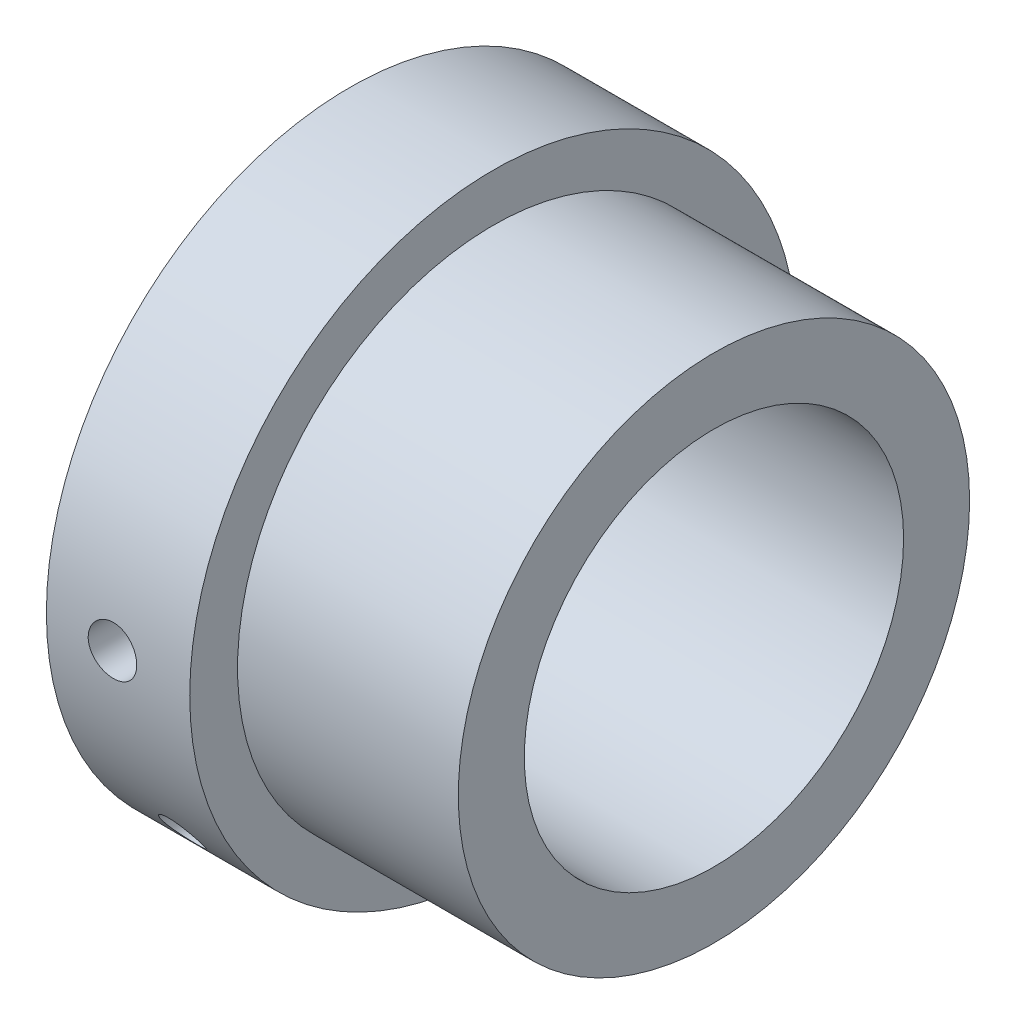
ISO-10303-21;
HEADER;
FILE_DESCRIPTION(('STEP AP214'),'2;1');
FILE_NAME('part.step','',(''),(''),'','','');
FILE_SCHEMA(('AUTOMOTIVE_DESIGN { 1 0 10303 214 1 1 1 1 }'));
ENDSEC;
DATA;
#1=APPLICATION_CONTEXT('core data for automotive mechanical design processes');
#2=APPLICATION_PROTOCOL_DEFINITION('international standard','automotive_design',2000,#1);
#3=PRODUCT_CONTEXT('',#1,'mechanical');
#4=PRODUCT('Part','Part','',(#3));
#5=PRODUCT_RELATED_PRODUCT_CATEGORY('part','',(#4));
#6=PRODUCT_DEFINITION_FORMATION('','',#4);
#7=PRODUCT_DEFINITION_CONTEXT('part definition',#1,'design');
#8=PRODUCT_DEFINITION('design','',#6,#7);
#9=PRODUCT_DEFINITION_SHAPE('','',#8);
#10=(LENGTH_UNIT() NAMED_UNIT(*) SI_UNIT(.MILLI.,.METRE.));
#11=(NAMED_UNIT(*) PLANE_ANGLE_UNIT() SI_UNIT($,.RADIAN.));
#12=(NAMED_UNIT(*) SI_UNIT($,.STERADIAN.) SOLID_ANGLE_UNIT());
#13=UNCERTAINTY_MEASURE_WITH_UNIT(LENGTH_MEASURE(1.E-05),#10,'distance_accuracy_value','');
#14=(GEOMETRIC_REPRESENTATION_CONTEXT(3) GLOBAL_UNCERTAINTY_ASSIGNED_CONTEXT((#13)) GLOBAL_UNIT_ASSIGNED_CONTEXT((#10,
#11,#12)) REPRESENTATION_CONTEXT('',''));
#15=CARTESIAN_POINT('',(0.,0.,0.));
#16=DIRECTION('',(0.,0.,1.));
#17=DIRECTION('',(1.,0.,0.));
#18=AXIS2_PLACEMENT_3D('',#15,#16,#17);
#19=CARTESIAN_POINT('',(7.62,0.,0.));
#20=DIRECTION('',(1.,0.,0.));
#21=DIRECTION('',(0.,0.,-1.));
#22=AXIS2_PLACEMENT_3D('',#19,#20,#21);
#23=PLANE('',#22);
#24=CARTESIAN_POINT('',(7.62,0.,0.));
#25=DIRECTION('',(1.,0.,0.));
#26=DIRECTION('',(0.,0.,-1.));
#27=AXIS2_PLACEMENT_3D('',#24,#25,#26);
#28=CIRCLE('',#27,5.35);
#29=CARTESIAN_POINT('',(7.62,0.,-5.35));
#30=VERTEX_POINT('',#29);
#31=EDGE_CURVE('E130',#30,#30,#28,.T.);
#32=ORIENTED_EDGE('',*,*,#31,.T.);
#33=EDGE_LOOP('',(#32));
#34=FACE_BOUND('',#33,.T.);
#35=CARTESIAN_POINT('',(7.62,0.,0.));
#36=DIRECTION('',(1.,0.,0.));
#37=DIRECTION('',(0.,0.,-1.));
#38=AXIS2_PLACEMENT_3D('',#35,#36,#37);
#39=CIRCLE('',#38,3.96875);
#40=CARTESIAN_POINT('',(7.62,0.,-3.96875));
#41=VERTEX_POINT('',#40);
#42=EDGE_CURVE('E78',#41,#41,#39,.T.);
#43=ORIENTED_EDGE('',*,*,#42,.F.);
#44=EDGE_LOOP('',(#43));
#45=FACE_BOUND('',#44,.T.);
#46=ADVANCED_FACE('F35',(#34,#45),#23,.T.);
#47=CARTESIAN_POINT('',(0.,0.,0.));
#48=DIRECTION('',(1.,0.,0.));
#49=DIRECTION('',(0.,0.,-1.));
#50=AXIS2_PLACEMENT_3D('',#47,#48,#49);
#51=PLANE('',#50);
#52=CARTESIAN_POINT('',(0.,0.,0.));
#53=DIRECTION('',(1.,0.,0.));
#54=DIRECTION('',(0.,0.,-1.));
#55=AXIS2_PLACEMENT_3D('',#52,#53,#54);
#56=CIRCLE('',#55,6.35);
#57=CARTESIAN_POINT('',(0.,0.,-6.35));
#58=VERTEX_POINT('',#57);
#59=EDGE_CURVE('E55',#58,#58,#56,.T.);
#60=ORIENTED_EDGE('',*,*,#59,.F.);
#61=EDGE_LOOP('',(#60));
#62=FACE_BOUND('',#61,.T.);
#63=CARTESIAN_POINT('',(0.,0.,0.));
#64=DIRECTION('',(1.,0.,0.));
#65=DIRECTION('',(0.,0.,-1.));
#66=AXIS2_PLACEMENT_3D('',#63,#64,#65);
#67=CIRCLE('',#66,3.96875);
#68=CARTESIAN_POINT('',(0.,0.,-3.96875));
#69=VERTEX_POINT('',#68);
#70=EDGE_CURVE('E81',#69,#69,#67,.T.);
#71=ORIENTED_EDGE('',*,*,#70,.T.);
#72=EDGE_LOOP('',(#71));
#73=FACE_BOUND('',#72,.T.);
#74=ADVANCED_FACE('F63',(#62,#73),#51,.F.);
#75=CARTESIAN_POINT('',(7.62,0.,0.));
#76=DIRECTION('',(-1.,0.,0.));
#77=DIRECTION('',(0.,0.,1.));
#78=AXIS2_PLACEMENT_3D('',#75,#76,#77);
#79=CYLINDRICAL_SURFACE('',#78,6.35);
#80=CARTESIAN_POINT('',(1.1310862135853,-3.81,-5.08));
#81=CARTESIAN_POINT('',(1.1273074103488,-3.83670016409556,-5.05998665050535));
#82=CARTESIAN_POINT('',(1.12625107344914,-3.86346071609858,-5.03957613850093));
#83=CARTESIAN_POINT('',(1.12946296625514,-3.91659363663765,-4.99838949073798));
#84=CARTESIAN_POINT('',(1.13375797171626,-3.94296337967661,-4.9776120333048));
#85=CARTESIAN_POINT('',(1.14793046063186,-3.99580241982986,-4.93530888541452));
#86=CARTESIAN_POINT('',(1.15807411132325,-4.02221185776081,-4.91379715844621));
#87=CARTESIAN_POINT('',(1.18417423920228,-4.07290881530768,-4.87185669391869));
#88=CARTESIAN_POINT('',(1.20011886789206,-4.09720053587885,-4.8514258454061));
#89=CARTESIAN_POINT('',(1.23229123404134,-4.13583091066784,-4.81848984233349));
#90=CARTESIAN_POINT('',(1.24700588442575,-4.15097244175653,-4.80544274393035));
#91=CARTESIAN_POINT('',(1.27940237293606,-4.17920917922161,-4.78090557898058));
#92=CARTESIAN_POINT('',(1.29707940847517,-4.19230763249837,-4.76941304582872));
#93=CARTESIAN_POINT('',(1.33135444126634,-4.21337244238693,-4.75080503611325));
#94=CARTESIAN_POINT('',(1.34741800259911,-4.22183987087403,-4.7432759740034));
#95=CARTESIAN_POINT('',(1.38118963097558,-4.23668157724432,-4.73002413271355));
#96=CARTESIAN_POINT('',(1.39889684292003,-4.24305693577123,-4.72430042105221));
#97=CARTESIAN_POINT('',(1.43574620928812,-4.25334714899132,-4.71503841420604));
#98=CARTESIAN_POINT('',(1.45489922111386,-4.25724076517623,-4.71151898739946));
#99=CARTESIAN_POINT('',(1.49386291191859,-4.26214762690369,-4.70708077321789));
#100=CARTESIAN_POINT('',(1.51367297633237,-4.26316349130313,-4.70615962132324));
#101=CARTESIAN_POINT('',(1.55045051857327,-4.26229353444219,-4.70694734535082));
#102=CARTESIAN_POINT('',(1.56743645902915,-4.26078531934921,-4.70831397420851));
#103=CARTESIAN_POINT('',(1.60081972974509,-4.25566854508927,-4.71293931696201));
#104=CARTESIAN_POINT('',(1.6172170113063,-4.25205981257287,-4.71619818701879));
#105=CARTESIAN_POINT('',(1.64905214289345,-4.24295638823937,-4.72438970498395));
#106=CARTESIAN_POINT('',(1.6644887575279,-4.23745932495115,-4.72932445746989));
#107=CARTESIAN_POINT('',(1.69413784299895,-4.2248522525324,-4.74059015490724));
#108=CARTESIAN_POINT('',(1.70834969405036,-4.21774143330554,-4.74692180104671));
#109=CARTESIAN_POINT('',(1.74159142584521,-4.19861954709216,-4.76385572875571));
#110=CARTESIAN_POINT('',(1.75986660724002,-4.18585189477416,-4.77508947652226));
#111=CARTESIAN_POINT('',(1.79343287325246,-4.158151326179,-4.79923087823228));
#112=CARTESIAN_POINT('',(1.80871751785829,-4.1432138551444,-4.81214204714621));
#113=CARTESIAN_POINT('',(1.84026919219236,-4.10719841513138,-4.84294631020778));
#114=CARTESIAN_POINT('',(1.85556618760021,-4.08558632886326,-4.86120791332548));
#115=CARTESIAN_POINT('',(1.88137576821344,-4.04048564603081,-4.89875900599605));
#116=CARTESIAN_POINT('',(1.89188311698793,-4.01699502851371,-4.91804959491492));
#117=CARTESIAN_POINT('',(1.90827873051137,-3.96842951747874,-4.95732356427644));
#118=CARTESIAN_POINT('',(1.91410019992331,-3.94333703530372,-4.97731286497628));
#119=CARTESIAN_POINT('',(1.9208126993765,-3.89248682991864,-5.01717883685181));
#120=CARTESIAN_POINT('',(1.92171504118839,-3.86673076990905,-5.03705566134277));
#121=CARTESIAN_POINT('',(1.91943639400927,-3.83062792487734,-5.0644804635371));
#122=CARTESIAN_POINT('',(1.9183801624172,-3.82030570113289,-5.07227162070097));
#123=CARTESIAN_POINT('',(1.9169137864147,-3.81,-5.08));
#124=B_SPLINE_CURVE_WITH_KNOTS('',3,(#80,#81,#82,#83,#84,#85,#86,#87,#88,#89,#90,#91,#92,#93,
#94,#95,#96,#97,#98,#99,#100,#101,#102,#103,#104,#105,#106,#107,#108,#109,#110,#111,#112,#113,
#114,#115,#116,#117,#118,#119,#120,#121,#122,#123),.UNSPECIFIED.,.F.,.F.,(4,2,2,2,2,2,2,2,2,2,2,
2,2,2,2,2,2,2,2,2,2,4),(0.,0.100602962659255,0.201711325757644,0.307831579932841,
0.413736289277865,0.487943450039435,0.562031450576583,0.620779037461321,0.679496230758781,
0.738709402221219,0.797868670245561,0.848942465179126,0.900020475678274,0.951162868735978,
1.00233099199705,1.07681018222779,1.15144803680098,1.24743975733277,1.34353617358291,
1.44097928368367,1.53819822384626,1.57709869586067),.UNSPECIFIED.);
#125=CARTESIAN_POINT('',(1.1310862135853,-3.81,-5.08));
#126=VERTEX_POINT('',#125);
#127=CARTESIAN_POINT('',(1.9169137864147,-3.81,-5.08));
#128=VERTEX_POINT('',#127);
#129=EDGE_CURVE('E44',#126,#128,#124,.T.);
#130=ORIENTED_EDGE('',*,*,#129,.T.);
#131=DIRECTION('',(-1.,0.,0.));
#132=VECTOR('',#131,1.);
#133=CARTESIAN_POINT('',(7.62,-3.81,-5.08));
#134=LINE('',#133,#132);
#135=EDGE_CURVE('E11',#128,#126,#134,.T.);
#136=ORIENTED_EDGE('',*,*,#135,.T.);
#137=EDGE_LOOP('',(#130,#136));
#138=FACE_BOUND('',#137,.T.);
#139=CARTESIAN_POINT('',(1.12712500000001,-3.86593319292026,5.03756494229875));
#140=CARTESIAN_POINT('',(1.1271249268216,-3.8392136354108,5.05806964823215));
#141=CARTESIAN_POINT('',(1.12982011408244,-3.81230777250014,5.07837731258606));
#142=CARTESIAN_POINT('',(1.14085812124443,-3.75890390094624,5.11803155501354));
#143=CARTESIAN_POINT('',(1.14920311851895,-3.73240605357575,5.13737775946463));
#144=CARTESIAN_POINT('',(1.16955579736268,-3.68596737245955,5.170763408327));
#145=CARTESIAN_POINT('',(1.18050416059085,-3.66577101936544,5.18509277787649));
#146=CARTESIAN_POINT('',(1.20628592368519,-3.62695926696501,5.212314830602));
#147=CARTESIAN_POINT('',(1.22111351780607,-3.608341559696,5.22520962004272));
#148=CARTESIAN_POINT('',(1.25187728490467,-3.57633294757058,5.24715703905342));
#149=CARTESIAN_POINT('',(1.26723825440713,-3.56258480602141,5.25649330540897));
#150=CARTESIAN_POINT('',(1.30050364375834,-3.53730751517441,5.2735365628973));
#151=CARTESIAN_POINT('',(1.31840755320554,-3.52577792167563,5.28124388021113));
#152=CARTESIAN_POINT('',(1.35655276409615,-3.50545983556497,5.29475231970968));
#153=CARTESIAN_POINT('',(1.37680904146925,-3.49669039044207,5.30054021021314));
#154=CARTESIAN_POINT('',(1.41897186483129,-3.48256414778071,5.30983236091619));
#155=CARTESIAN_POINT('',(1.44087711507065,-3.47720470135972,5.31333839370847));
#156=CARTESIAN_POINT('',(1.48278657794326,-3.47070568105289,5.31758544448331));
#157=CARTESIAN_POINT('',(1.50269507436219,-3.46912970061378,5.31861249707329));
#158=CARTESIAN_POINT('',(1.54252321095424,-3.46899155928612,5.31870264285304));
#159=CARTESIAN_POINT('',(1.56244284355337,-3.47042820079955,5.31776651645911));
#160=CARTESIAN_POINT('',(1.60051170899984,-3.47605560992788,5.31408952009604));
#161=CARTESIAN_POINT('',(1.61869646628778,-3.48008100724868,5.31145699721213));
#162=CARTESIAN_POINT('',(1.65404856978977,-3.49051753395339,5.30460422992244));
#163=CARTESIAN_POINT('',(1.67121584119134,-3.49692883851374,5.30038386893526));
#164=CARTESIAN_POINT('',(1.70485329196628,-3.5121579924167,5.29030552777349));
#165=CARTESIAN_POINT('',(1.72126446320468,-3.52106512293664,5.28438654486418));
#166=CARTESIAN_POINT('',(1.75230149788748,-3.54077687858786,5.27119906397824));
#167=CARTESIAN_POINT('',(1.76692668916079,-3.55158221441923,5.26393006048684));
#168=CARTESIAN_POINT('',(1.7958486324538,-3.57609054103609,5.24731552219702));
#169=CARTESIAN_POINT('',(1.80989937420669,-3.58998532285461,5.23782583304647));
#170=CARTESIAN_POINT('',(1.83545789453093,-3.61919247826826,5.21768732663845));
#171=CARTESIAN_POINT('',(1.84696430302025,-3.63450560935502,5.20703788945955));
#172=CARTESIAN_POINT('',(1.86915103871758,-3.66879229089926,5.1829500782919));
#173=CARTESIAN_POINT('',(1.87936673160392,-3.68794824661479,5.16934391743054));
#174=CARTESIAN_POINT('',(1.8964007528715,-3.7270687242649,5.14121006008596));
#175=CARTESIAN_POINT('',(1.90321714914054,-3.74703369908028,5.12668184479585));
#176=CARTESIAN_POINT('',(1.9145122765028,-3.79100294298973,5.09427817490664));
#177=CARTESIAN_POINT('',(1.91833953580406,-3.8150808894318,5.07627484819691));
#178=CARTESIAN_POINT('',(1.92159766717226,-3.86317085018693,5.03977429300028));
#179=CARTESIAN_POINT('',(1.92102464959599,-3.88718278739408,5.0212766419472));
#180=CARTESIAN_POINT('',(1.91522662596335,-3.93801379401877,4.9815387736605));
#181=CARTESIAN_POINT('',(1.90935303555366,-3.96474769581075,4.96028185070325));
#182=CARTESIAN_POINT('',(1.89210796513954,-4.01678963995018,4.91823330888879));
#183=CARTESIAN_POINT('',(1.88073701617414,-4.04209781975727,4.89744164529094));
#184=CARTESIAN_POINT('',(1.85502683152216,-4.08605915590504,4.86079059135888));
#185=CARTESIAN_POINT('',(1.84161272385443,-4.10508222214455,4.84472531173107));
#186=CARTESIAN_POINT('',(1.81098002648749,-4.14108628577517,4.81398603854567));
#187=CARTESIAN_POINT('',(1.79376713790178,-4.15807028498665,4.79931000671074));
#188=CARTESIAN_POINT('',(1.76004973616495,-4.185533479858,4.77535965743385));
#189=CARTESIAN_POINT('',(1.7443478242895,-4.19659957815033,4.76563023718205));
#190=CARTESIAN_POINT('',(1.71078118972755,-4.21665145058262,4.74789734875776));
#191=CARTESIAN_POINT('',(1.69291928089848,-4.22563988778558,4.73989167207183));
#192=CARTESIAN_POINT('',(1.65847668752781,-4.23971250621507,4.72730493574317));
#193=CARTESIAN_POINT('',(1.64219000704911,-4.24519985652576,4.722373709052));
#194=CARTESIAN_POINT('',(1.60861077660303,-4.2540718365167,4.71438318557331));
#195=CARTESIAN_POINT('',(1.59131889339518,-4.2574578430171,4.71132266310274));
#196=CARTESIAN_POINT('',(1.55611475393944,-4.26190585483227,4.70729943292096));
#197=CARTESIAN_POINT('',(1.53820012402701,-4.26295767541261,4.70634591877879));
#198=CARTESIAN_POINT('',(1.50241224567989,-4.26262433042342,4.70664783854596));
#199=CARTESIAN_POINT('',(1.48453899596874,-4.26123924105635,4.70790320338341));
#200=CARTESIAN_POINT('',(1.45065353756087,-4.25632111434795,4.71234975180969));
#201=CARTESIAN_POINT('',(1.43459878760877,-4.25294577439336,4.71539877719463));
#202=CARTESIAN_POINT('',(1.40339129913322,-4.24438445704686,4.72310634480055));
#203=CARTESIAN_POINT('',(1.38823872534889,-4.23919815014856,4.72776517992565));
#204=CARTESIAN_POINT('',(1.35783742147062,-4.22675465158305,4.7388943970665));
#205=CARTESIAN_POINT('',(1.34269028856712,-4.21935876537656,4.74548522085111));
#206=CARTESIAN_POINT('',(1.31390447787453,-4.20304437286163,4.75994088099019));
#207=CARTESIAN_POINT('',(1.3002669373991,-4.1941247312636,4.76780666704315));
#208=CARTESIAN_POINT('',(1.26780550054195,-4.17002264653716,4.78892296849341));
#209=CARTESIAN_POINT('',(1.25002060381243,-4.15401172488706,4.80283151830985));
#210=CARTESIAN_POINT('',(1.21809588693695,-4.11986405645101,4.83215574496593));
#211=CARTESIAN_POINT('',(1.20396361034512,-4.10172302100088,4.84757445156357));
#212=CARTESIAN_POINT('',(1.17905237975784,-4.06354328770071,4.87962588155803));
#213=CARTESIAN_POINT('',(1.16834063150195,-4.04347558682821,4.89627584228386));
#214=CARTESIAN_POINT('',(1.15058331650321,-4.00221746147103,4.93005731786736));
#215=CARTESIAN_POINT('',(1.14353275761778,-3.98102860940829,4.94718814325601));
#216=CARTESIAN_POINT('',(1.13459607077777,-3.94417483152547,4.97658200500612));
#217=CARTESIAN_POINT('',(1.13180424853245,-3.92869605216406,4.98881142531121));
#218=CARTESIAN_POINT('',(1.12806811377937,-3.89747775332312,5.01323854292444));
#219=CARTESIAN_POINT('',(1.12712504328574,-3.88173806571641,5.02543621341223));
#220=CARTESIAN_POINT('',(1.12712500000001,-3.86593319292026,5.03756494229875));
#221=B_SPLINE_CURVE_WITH_KNOTS('',3,(#139,#140,#141,#142,#143,#144,#145,#146,#147,#148,#149,
#150,#151,#152,#153,#154,#155,#156,#157,#158,#159,#160,#161,#162,#163,#164,#165,#166,#167,#168,
#169,#170,#171,#172,#173,#174,#175,#176,#177,#178,#179,#180,#181,#182,#183,#184,#185,#186,#187,
#188,#189,#190,#191,#192,#193,#194,#195,#196,#197,#198,#199,#200,#201,#202,#203,#204,#205,#206,
#207,#208,#209,#210,#211,#212,#213,#214,#215,#216,#217,#218,#219,#220),.UNSPECIFIED.,.T.,.F.,(4,
2,2,2,2,2,2,2,2,2,2,2,2,2,2,2,2,2,2,2,2,2,2,2,2,2,2,2,2,2,2,2,2,2,2,2,2,2,2,2,4),(0.,
0.100974233923036,0.201987404350408,0.282899330938074,0.363690848816604,0.431305862790234,
0.498907324667257,0.566965557092956,0.634970857219137,0.694647909191447,0.754301242432324,
0.810478383936165,0.86665965085379,0.925185982392271,0.983734273444255,1.04924702344026,
1.11479496553844,1.19137026078297,1.26798903087833,1.35855608052796,1.44920319651064,
1.5527132441846,1.6562132948946,1.74075643969528,1.82517355683309,1.88954244580907,
1.95382836605598,2.00724487171332,2.06062634132216,2.11424027566758,2.16785253352883,
2.2176992503064,2.26755504145009,2.32165446396735,2.37579437102608,2.45837544156852,
2.54112572348019,2.62541398166469,2.70958700645831,2.76927414287194,2.82900136411342),.UNSPECIFIED.);
#222=CARTESIAN_POINT('',(1.12712500000001,-3.86593319292026,5.03756494229875));
#223=VERTEX_POINT('',#222);
#224=EDGE_CURVE('E58',#223,#223,#221,.T.);
#225=ORIENTED_EDGE('',*,*,#224,.T.);
#226=EDGE_LOOP('',(#225));
#227=FACE_BOUND('',#226,.T.);
#228=CARTESIAN_POINT('',(1.89094283641369,0.,6.35));
#229=CARTESIAN_POINT('',(1.89094159048129,-0.0284857193049498,6.34999973306454));
#230=CARTESIAN_POINT('',(1.88853880546916,-0.0569909297890136,6.34980627761363));
#231=CARTESIAN_POINT('',(1.8789888398343,-0.113212953756505,6.34905314531252));
#232=CARTESIAN_POINT('',(1.87183625779753,-0.14092883215566,6.34849305153583));
#233=CARTESIAN_POINT('',(1.85299460623761,-0.194749765443451,6.34706994815829));
#234=CARTESIAN_POINT('',(1.84130807252117,-0.220855711313532,6.34620710790711));
#235=CARTESIAN_POINT('',(1.81373471850442,-0.270729092285767,6.34427532502263));
#236=CARTESIAN_POINT('',(1.79784880799933,-0.294497032388439,6.3432064270453));
#237=CARTESIAN_POINT('',(1.76228707024275,-0.339082176985212,6.34097968761358));
#238=CARTESIAN_POINT('',(1.74260338468129,-0.359893105071176,6.33982166478266));
#239=CARTESIAN_POINT('',(1.70002140030455,-0.397919651537022,6.33754871818422));
#240=CARTESIAN_POINT('',(1.6771229616143,-0.415135113395858,6.33643379629473));
#241=CARTESIAN_POINT('',(1.62872378863297,-0.44550304300868,6.3343713070339));
#242=CARTESIAN_POINT('',(1.60321960756653,-0.458650034119346,6.33342396597426));
#243=CARTESIAN_POINT('',(1.55035696404539,-0.480472836968702,6.33180592668721));
#244=CARTESIAN_POINT('',(1.5229985320434,-0.489148722117044,6.3311352239178));
#245=CARTESIAN_POINT('',(1.46726657987622,-0.501764932611031,6.33014789143902));
#246=CARTESIAN_POINT('',(1.43889537714847,-0.505715434693829,6.3298305009277));
#247=CARTESIAN_POINT('',(1.38189093364751,-0.508800173836419,6.32958331178566));
#248=CARTESIAN_POINT('',(1.35325769745069,-0.507934494850928,6.32965350639863));
#249=CARTESIAN_POINT('',(1.29661164840987,-0.501419861212218,6.33017286623199));
#250=CARTESIAN_POINT('',(1.26859755544971,-0.495781957877885,6.33062115586704));
#251=CARTESIAN_POINT('',(1.21391457917599,-0.479900079390112,6.33184481894731));
#252=CARTESIAN_POINT('',(1.18724570809859,-0.4696560623478,6.33262019536711));
#253=CARTESIAN_POINT('',(1.13597493592849,-0.444840341898172,6.33441167184783));
#254=CARTESIAN_POINT('',(1.11137544948752,-0.430263670413183,6.33542804798118));
#255=CARTESIAN_POINT('',(1.0649681398234,-0.397200003571505,6.33758674207351));
#256=CARTESIAN_POINT('',(1.0431603686517,-0.378712935322625,6.33872906237996));
#257=CARTESIAN_POINT('',(1.00289126732389,-0.338291224851532,6.34101482430859));
#258=CARTESIAN_POINT('',(0.984439527490998,-0.316347026823728,6.34215826003943));
#259=CARTESIAN_POINT('',(0.951480384667291,-0.269667338287703,6.34431434523044));
#260=CARTESIAN_POINT('',(0.936972984048608,-0.244931846100804,6.34532699461195));
#261=CARTESIAN_POINT('',(0.912314966694846,-0.193365559634019,6.34710757815558));
#262=CARTESIAN_POINT('',(0.902164763696921,-0.166534566661897,6.3478754890768));
#263=CARTESIAN_POINT('',(0.886515927733026,-0.111541725627414,6.34907979854185));
#264=CARTESIAN_POINT('',(0.881017205802822,-0.0833799030293798,6.34951620342605));
#265=CARTESIAN_POINT('',(0.874839419311573,-0.0266079550879084,6.3500075151304));
#266=CARTESIAN_POINT('',(0.874147105738673,0.00200071984579208,6.35006347066203));
#267=CARTESIAN_POINT('',(0.877567096564487,0.058927339165514,6.34979037777372));
#268=CARTESIAN_POINT('',(0.881679359709895,0.0872452860456938,6.3494613326595));
#269=CARTESIAN_POINT('',(0.894580792673074,0.142748910861868,6.34845592449252));
#270=CARTESIAN_POINT('',(0.903363832546797,0.169936022602307,6.34778001670416));
#271=CARTESIAN_POINT('',(0.9253512462288,0.222450620449516,6.34615683214426));
#272=CARTESIAN_POINT('',(0.938555684618679,0.247778079386495,6.3452095514089));
#273=CARTESIAN_POINT('',(0.969044442229297,0.295914780029602,6.34314724059117));
#274=CARTESIAN_POINT('',(0.986337551516296,0.318718438656433,6.34203185099799));
#275=CARTESIAN_POINT('',(1.02450004822636,0.361103896466337,6.33975988334265));
#276=CARTESIAN_POINT('',(1.04536949291857,0.380685644045942,6.33860330462116));
#277=CARTESIAN_POINT('',(1.09014968742161,0.416116771417106,6.33637621870337));
#278=CARTESIAN_POINT('',(1.11406728236024,0.431957514397432,6.33530591436532));
#279=CARTESIAN_POINT('',(1.16423071437406,0.459397778469857,6.33337538018158));
#280=CARTESIAN_POINT('',(1.19047652976876,0.470997339050883,6.33251514837997));
#281=CARTESIAN_POINT('',(1.24452062617096,0.489611213131012,6.33110326059578));
#282=CARTESIAN_POINT('',(1.2723170673333,0.496630840273304,6.33055124712568));
#283=CARTESIAN_POINT('',(1.32869863418875,0.505902896098149,6.32981707724986));
#284=CARTESIAN_POINT('',(1.35728374604685,0.508155408352447,6.32963491436035));
#285=CARTESIAN_POINT('',(1.41434539170527,0.50782836068627,6.32966115537756));
#286=CARTESIAN_POINT('',(1.44282200477946,0.505262372155452,6.32986846233658));
#287=CARTESIAN_POINT('',(1.49893849008682,0.495399432338358,6.33064795502181));
#288=CARTESIAN_POINT('',(1.52657836099383,0.488102473554294,6.3312201413263));
#289=CARTESIAN_POINT('',(1.58023784207299,0.468988103951374,6.33266463493847));
#290=CARTESIAN_POINT('',(1.60625752903804,0.45717090757104,6.333536928009));
#291=CARTESIAN_POINT('',(1.65594582132287,0.42935307008977,6.335483367119));
#292=CARTESIAN_POINT('',(1.67961446780627,0.413352502251983,6.33655750962339));
#293=CARTESIAN_POINT('',(1.72399820699637,0.377571183669623,6.33879020633748));
#294=CARTESIAN_POINT('',(1.7447052074538,0.357780408889134,6.3399489792274));
#295=CARTESIAN_POINT('',(1.78251155330733,0.314998139026026,6.34221838384599));
#296=CARTESIAN_POINT('',(1.79961002287516,0.292005869149354,6.3433290038356));
#297=CARTESIAN_POINT('',(1.82973497156367,0.243432272528466,6.34537881046931));
#298=CARTESIAN_POINT('',(1.84275428308252,0.217846491872762,6.34631769415973));
#299=CARTESIAN_POINT('',(1.86429557931457,0.164862237306823,6.34791461959161));
#300=CARTESIAN_POINT('',(1.87282275115305,0.137465895413467,6.34857298508189));
#301=CARTESIAN_POINT('',(1.88295799863565,0.0915890290271699,6.34936504954435));
#302=CARTESIAN_POINT('',(1.88594835240292,0.0734038311266429,6.34960207664132));
#303=CARTESIAN_POINT('',(1.88994117154486,0.036815136034101,6.34991963794666));
#304=CARTESIAN_POINT('',(1.8909436417175,0.0184116393690799,6.35000017253275));
#305=CARTESIAN_POINT('',(1.89094283641369,0.,6.35));
#306=B_SPLINE_CURVE_WITH_KNOTS('',3,(#228,#229,#230,#231,#232,#233,#234,#235,#236,#237,#238,
#239,#240,#241,#242,#243,#244,#245,#246,#247,#248,#249,#250,#251,#252,#253,#254,#255,#256,#257,
#258,#259,#260,#261,#262,#263,#264,#265,#266,#267,#268,#269,#270,#271,#272,#273,#274,#275,#276,
#277,#278,#279,#280,#281,#282,#283,#284,#285,#286,#287,#288,#289,#290,#291,#292,#293,#294,#295,
#296,#297,#298,#299,#300,#301,#302,#303,#304,#305),.UNSPECIFIED.,.T.,.F.,(4,2,2,2,2,2,2,2,2,2,2,
2,2,2,2,2,2,2,2,2,2,2,2,2,2,2,2,2,2,2,2,2,2,2,2,2,2,2,4),(0.,0.0853899369780829,
0.170877145070279,0.256316609546171,0.341737578706345,0.427337233123012,0.512940613163868,
0.598658729214787,0.684375437842656,0.769907209908598,0.85543749100627,0.940770244808274,
1.02610377465822,1.11153553295622,1.19696888389491,1.2826426627841,1.36831649319753,
1.45399845696028,1.5396787819326,1.6251228323551,1.71056614913882,1.7958976055482,
1.88123030841439,1.96674815997967,2.05226738110112,2.13798215036407,2.22369612153107,
2.30931046959025,2.39492331674168,2.48029539544671,2.56566760945238,2.65103577393167,
2.73640244346323,2.82199808210229,2.90761447186854,2.99338046765522,3.0790472101739,
3.13423881348784,3.1894302835911),.UNSPECIFIED.);
#307=CARTESIAN_POINT('',(1.89094283641369,0.,6.35));
#308=VERTEX_POINT('',#307);
#309=EDGE_CURVE('E70',#308,#308,#306,.T.);
#310=ORIENTED_EDGE('',*,*,#309,.T.);
#311=EDGE_LOOP('',(#310));
#312=FACE_BOUND('',#311,.T.);
#313=CARTESIAN_POINT('',(3.,0.,0.));
#314=DIRECTION('',(1.,0.,0.));
#315=DIRECTION('',(0.,0.,-1.));
#316=AXIS2_PLACEMENT_3D('',#313,#314,#315);
#317=CIRCLE('',#316,6.35);
#318=CARTESIAN_POINT('',(3.,0.,-6.35));
#319=VERTEX_POINT('',#318);
#320=EDGE_CURVE('E74',#319,#319,#317,.T.);
#321=ORIENTED_EDGE('',*,*,#320,.F.);
#322=EDGE_LOOP('',(#321));
#323=FACE_BOUND('',#322,.T.);
#324=ORIENTED_EDGE('',*,*,#59,.T.);
#325=EDGE_LOOP('',(#324));
#326=FACE_BOUND('',#325,.T.);
#327=ADVANCED_FACE('F37',(#138,#227,#312,#323,#326),#79,.T.);
#328=CARTESIAN_POINT('',(7.62,0.,0.));
#329=DIRECTION('',(-1.,0.,0.));
#330=DIRECTION('',(0.,0.,1.));
#331=AXIS2_PLACEMENT_3D('',#328,#329,#330);
#332=CYLINDRICAL_SURFACE('',#331,3.96875);
#333=CARTESIAN_POINT('',(1.12712500000001,-3.86593319292026,0.897517192246117));
#334=CARTESIAN_POINT('',(1.12712784444321,-3.85059546150369,0.963582128239832));
#335=CARTESIAN_POINT('',(1.12800028788654,-3.83356290294999,1.0292544419874));
#336=CARTESIAN_POINT('',(1.13285047189897,-3.7961509404297,1.15966605353678));
#337=CARTESIAN_POINT('',(1.13683370893339,-3.77576566291764,1.22440349309504));
#338=CARTESIAN_POINT('',(1.14966485246856,-3.73214859680331,1.35147133313962));
#339=CARTESIAN_POINT('',(1.15844244483688,-3.7089616370032,1.413822908842));
#340=CARTESIAN_POINT('',(1.17728173300381,-3.67233466118173,1.50532901650065));
#341=CARTESIAN_POINT('',(1.18449055586871,-3.65983988103611,1.53544649106328));
#342=CARTESIAN_POINT('',(1.20131617952824,-3.63437465670541,1.59478361820304));
#343=CARTESIAN_POINT('',(1.21093051697838,-3.62140471063659,1.6240041551232));
#344=CARTESIAN_POINT('',(1.22967915480406,-3.59943604365332,1.67197297475639));
#345=CARTESIAN_POINT('',(1.23797812319732,-3.59049804176497,1.69107375255043));
#346=CARTESIAN_POINT('',(1.25632434729249,-3.57263456611313,1.72849310445338));
#347=CARTESIAN_POINT('',(1.26637489062306,-3.56370914830672,1.74681012549163));
#348=CARTESIAN_POINT('',(1.28866129512802,-3.54604329527777,1.78240033295403));
#349=CARTESIAN_POINT('',(1.30091255632722,-3.53730468340383,1.79966493433443));
#350=CARTESIAN_POINT('',(1.32800381636336,-3.52046380376115,1.83238823772964));
#351=CARTESIAN_POINT('',(1.34283750162275,-3.51236005235817,1.84785119400567));
#352=CARTESIAN_POINT('',(1.36919100861436,-3.50033201656008,1.87049419621994));
#353=CARTESIAN_POINT('',(1.37976144105394,-3.49600659681097,1.87855922791945));
#354=CARTESIAN_POINT('',(1.40210202591988,-3.4880560657612,1.89328050570147));
#355=CARTESIAN_POINT('',(1.41387199395219,-3.4844308470721,1.89993696782848));
#356=CARTESIAN_POINT('',(1.43870981780769,-3.4781171314191,1.91147115981328));
#357=CARTESIAN_POINT('',(1.45179264929328,-3.47544152051998,1.91632445942978));
#358=CARTESIAN_POINT('',(1.4788035786515,-3.47140548816101,1.92362643831279));
#359=CARTESIAN_POINT('',(1.49272986818178,-3.47004235197974,1.92608008119333));
#360=CARTESIAN_POINT('',(1.51879767372098,-3.46890984426621,1.92811876911067));
#361=CARTESIAN_POINT('',(1.53090229660087,-3.46893651685396,1.92807090866671));
#362=CARTESIAN_POINT('',(1.55489146919412,-3.47008013935606,1.92601187482253));
#363=CARTESIAN_POINT('',(1.56677596140866,-3.47119737014684,1.92400019563507));
#364=CARTESIAN_POINT('',(1.58895361952228,-3.47426305424791,1.91845811866214));
#365=CARTESIAN_POINT('',(1.59929564309147,-3.47613153754585,1.91507361326632));
#366=CARTESIAN_POINT('',(1.61932139354978,-3.48053881544153,1.90705195373507));
#367=CARTESIAN_POINT('',(1.62900499163557,-3.48307774072162,1.90241455538206));
#368=CARTESIAN_POINT('',(1.6533446981114,-3.49039897978309,1.88896258785352));
#369=CARTESIAN_POINT('',(1.66741984387725,-3.49560365892549,1.87932789140944));
#370=CARTESIAN_POINT('',(1.69370155494792,-3.50688350002756,1.85819533235401));
#371=CARTESIAN_POINT('',(1.7059022715245,-3.51296127653455,1.84669185952065));
#372=CARTESIAN_POINT('',(1.73654358391967,-3.53003968341285,1.81392694412064));
#373=CARTESIAN_POINT('',(1.75340629374397,-3.54151894926235,1.79145260793966));
#374=CARTESIAN_POINT('',(1.78337189472292,-3.56493961696653,1.7443857555692));
#375=CARTESIAN_POINT('',(1.79646592024986,-3.57688203473712,1.71978841884299));
#376=CARTESIAN_POINT('',(1.81999502514923,-3.60100662774406,1.6686951626898));
#377=CARTESIAN_POINT('',(1.83036397288563,-3.61318818121239,1.6421690566794));
#378=CARTESIAN_POINT('',(1.84872057540687,-3.63725182796304,1.5881600176791));
#379=CARTESIAN_POINT('',(1.85670570231418,-3.64913359120542,1.5606761032344));
#380=CARTESIAN_POINT('',(1.87078893722647,-3.67245715896561,1.50497474822478));
#381=CARTESIAN_POINT('',(1.87688253919225,-3.68389785689051,1.47675572704056));
#382=CARTESIAN_POINT('',(1.88752570905102,-3.70621088855625,1.41982829212603));
#383=CARTESIAN_POINT('',(1.89207594902936,-3.71708346794532,1.39112009715018));
#384=CARTESIAN_POINT('',(1.90174310101379,-3.74308341252058,1.31997140342775));
#385=CARTESIAN_POINT('',(1.90615271763532,-3.75785918148512,1.27730670802096));
#386=CARTESIAN_POINT('',(1.91300756083082,-3.78598889090967,1.19134930554957));
#387=CARTESIAN_POINT('',(1.91545191962401,-3.79934220101247,1.14805632964118));
#388=CARTESIAN_POINT('',(1.92066315030733,-3.83722127559209,1.01732217253819));
#389=CARTESIAN_POINT('',(1.92129512764771,-3.85952175130294,0.929147203931789));
#390=CARTESIAN_POINT('',(1.92003853975071,-3.89804944347551,0.751327581104407));
#391=CARTESIAN_POINT('',(1.91814403048683,-3.91426222236336,0.661679952854411));
#392=CARTESIAN_POINT('',(1.91403813459584,-3.94047561427179,0.481560957330629));
#393=CARTESIAN_POINT('',(1.91182701345962,-3.95048139497965,0.39109033909824));
#394=CARTESIAN_POINT('',(1.90849059928467,-3.96459211550521,0.205179396943166));
#395=CARTESIAN_POINT('',(1.90742415585712,-3.96838211979256,0.109713785474248));
#396=CARTESIAN_POINT('',(1.90724058771845,-3.96906693427199,-0.0812749995283741));
#397=CARTESIAN_POINT('',(1.90812407604245,-3.96595957601434,-0.176798181722986));
#398=CARTESIAN_POINT('',(1.91129270234294,-3.95286995506432,-0.367302091017419));
#399=CARTESIAN_POINT('',(1.91357728878169,-3.94289039740121,-0.462283016732913));
#400=CARTESIAN_POINT('',(1.9179246590631,-3.91611277324392,-0.651258817929799));
#401=CARTESIAN_POINT('',(1.91998753082375,-3.89931742217304,-0.745254070823959));
#402=CARTESIAN_POINT('',(1.92103751260028,-3.86758596292786,-0.892051442156716));
#403=CARTESIAN_POINT('',(1.92096064988787,-3.85490685199015,-0.945340574557471));
#404=CARTESIAN_POINT('',(1.91923826566378,-3.82736174856561,-1.05132048817455));
#405=CARTESIAN_POINT('',(1.91759310693152,-3.81249626250527,-1.10401140491827));
#406=CARTESIAN_POINT('',(1.9119406681633,-3.78064729958821,-1.20857958870066));
#407=CARTESIAN_POINT('',(1.90793572970191,-3.76366593543939,-1.26045761004859));
#408=CARTESIAN_POINT('',(1.89650854890486,-3.72771944169028,-1.36309939932683));
#409=CARTESIAN_POINT('',(1.88908953747165,-3.70875620072051,-1.41386417329703));
#410=CARTESIAN_POINT('',(1.86927595039125,-3.66896328971561,-1.51413194760297));
#411=CARTESIAN_POINT('',(1.85685200515842,-3.64812317649818,-1.56362563263528));
#412=CARTESIAN_POINT('',(1.83266856392041,-3.61611528679391,-1.63565958839196));
#413=CARTESIAN_POINT('',(1.82368736958969,-3.60532568312799,-1.65929443908184));
#414=CARTESIAN_POINT('',(1.80341161318485,-3.58369318304283,-1.70551075610423));
#415=CARTESIAN_POINT('',(1.79212004266906,-3.57285037306134,-1.72809353873009));
#416=CARTESIAN_POINT('',(1.76653660276607,-3.55134103021817,-1.77187833724596));
#417=CARTESIAN_POINT('',(1.75222328093728,-3.54067637996235,-1.79306897833154));
#418=CARTESIAN_POINT('',(1.71988246232459,-3.52024038363727,-1.83285997773098));
#419=CARTESIAN_POINT('',(1.70187661139583,-3.51046429023479,-1.85147441824098));
#420=CARTESIAN_POINT('',(1.6717928689707,-3.49744840502847,-1.87587737029036));
#421=CARTESIAN_POINT('',(1.66141932608201,-3.49343015316279,-1.88334343215298));
#422=CARTESIAN_POINT('',(1.63956850546898,-3.48608244642992,-1.89690922109188));
#423=CARTESIAN_POINT('',(1.62809114882256,-3.48275304086857,-1.90300885036501));
#424=CARTESIAN_POINT('',(1.60397984211489,-3.47700134259534,-1.9134980850696));
#425=CARTESIAN_POINT('',(1.59133400042038,-3.47459004201191,-1.91786699280221));
#426=CARTESIAN_POINT('',(1.56531394813061,-3.47099732882346,-1.92436183060462));
#427=CARTESIAN_POINT('',(1.55194105055252,-3.46981377186237,-1.9264916714782));
#428=CARTESIAN_POINT('',(1.52660782839673,-3.46888908906573,-1.92815603184175));
#429=CARTESIAN_POINT('',(1.51467130121854,-3.46899144161321,-1.9279721713973));
#430=CARTESIAN_POINT('',(1.49103731173645,-3.47025239778646,-1.92570155552463));
#431=CARTESIAN_POINT('',(1.47933992370782,-3.47141132463147,-1.92361421779897));
#432=CARTESIAN_POINT('',(1.45735460404823,-3.47454744440141,-1.91794316725115));
#433=CARTESIAN_POINT('',(1.44702581757798,-3.47645976181642,-1.91447792750805));
#434=CARTESIAN_POINT('',(1.42703539391345,-3.48094916205028,-1.90630305498204));
#435=CARTESIAN_POINT('',(1.41737390614396,-3.48352639315198,-1.9015931446186));
#436=CARTESIAN_POINT('',(1.39298005061775,-3.49097586889556,-1.88789722364275));
#437=CARTESIAN_POINT('',(1.37884729326637,-3.49627644096513,-1.87807728559927));
#438=CARTESIAN_POINT('',(1.35248000284527,-3.50774554832076,-1.85656891367283));
#439=CARTESIAN_POINT('',(1.3402514848326,-3.51391672114475,-1.84487478660499));
#440=CARTESIAN_POINT('',(1.30948364709594,-3.53128329317564,-1.81151055685868));
#441=CARTESIAN_POINT('',(1.29256091054453,-3.54295763964351,-1.78861241326721));
#442=CARTESIAN_POINT('',(1.26253372537231,-3.56674850965125,-1.7406913081638));
#443=CARTESIAN_POINT('',(1.24943813299496,-3.57886598691135,-1.71566358865353));
#444=CARTESIAN_POINT('',(1.22589670908864,-3.60336976776125,-1.66359614688387));
#445=CARTESIAN_POINT('',(1.21552976546921,-3.61575474434934,-1.63652079102712));
#446=CARTESIAN_POINT('',(1.19721801341915,-3.64019812119434,-1.58140622315447));
#447=CARTESIAN_POINT('',(1.18927579180692,-3.65225616025192,-1.55336601701496));
#448=CARTESIAN_POINT('',(1.17530443161893,-3.67590678066041,-1.49654122233923));
#449=CARTESIAN_POINT('',(1.16928024693165,-3.68749809024333,-1.4677549106121));
#450=CARTESIAN_POINT('',(1.15879419711181,-3.71008360135106,-1.40969037397509));
#451=CARTESIAN_POINT('',(1.15433164788252,-3.72107806254602,-1.38041237036334));
#452=CARTESIAN_POINT('',(1.14490103834455,-3.74732239291759,-1.30791563556657));
#453=CARTESIAN_POINT('',(1.14064281337521,-3.76220642132064,-1.26447252254842));
#454=CARTESIAN_POINT('',(1.13409149215621,-3.79049739304778,-1.1769556138386));
#455=CARTESIAN_POINT('',(1.13179925662614,-3.80390368717662,-1.13288155049016));
#456=CARTESIAN_POINT('',(1.12702729687435,-3.84186070037813,-0.999798111290183));
#457=CARTESIAN_POINT('',(1.12666483569237,-3.86410490784003,-0.910050667506339));
#458=CARTESIAN_POINT('',(1.12833623840221,-3.90228332302929,-0.729193099829014));
#459=CARTESIAN_POINT('',(1.13037262698188,-3.91821085912804,-0.638081640078255));
#460=CARTESIAN_POINT('',(1.13459575652847,-3.94365763763317,-0.455046898391275));
#461=CARTESIAN_POINT('',(1.13678236669781,-3.95318237891186,-0.363124381935274));
#462=CARTESIAN_POINT('',(1.13992541651488,-3.96616133130673,-0.1734667315614));
#463=CARTESIAN_POINT('',(1.14080318943594,-3.96923159865369,-0.0757035660096595));
#464=CARTESIAN_POINT('',(1.14051285412143,-3.96814579222808,0.119821660688317));
#465=CARTESIAN_POINT('',(1.13934385117426,-3.96398655821355,0.217583702661303));
#466=CARTESIAN_POINT('',(1.13571051409618,-3.94841816637192,0.413096974789223));
#467=CARTESIAN_POINT('',(1.13323831099222,-3.93696487723108,0.510844490970863));
#468=CARTESIAN_POINT('',(1.12894373467949,-3.90683543262054,0.705174817535278));
#469=CARTESIAN_POINT('',(1.12712087708191,-3.88816468289302,0.801758443953773));
#470=CARTESIAN_POINT('',(1.12712500000001,-3.86593319292026,0.897517192246117));
#471=B_SPLINE_CURVE_WITH_KNOTS('',3,(#333,#334,#335,#336,#337,#338,#339,#340,#341,#342,#343,
#344,#345,#346,#347,#348,#349,#350,#351,#352,#353,#354,#355,#356,#357,#358,#359,#360,#361,#362,
#363,#364,#365,#366,#367,#368,#369,#370,#371,#372,#373,#374,#375,#376,#377,#378,#379,#380,#381,
#382,#383,#384,#385,#386,#387,#388,#389,#390,#391,#392,#393,#394,#395,#396,#397,#398,#399,#400,
#401,#402,#403,#404,#405,#406,#407,#408,#409,#410,#411,#412,#413,#414,#415,#416,#417,#418,#419,
#420,#421,#422,#423,#424,#425,#426,#427,#428,#429,#430,#431,#432,#433,#434,#435,#436,#437,#438,
#439,#440,#441,#442,#443,#444,#445,#446,#447,#448,#449,#450,#451,#452,#453,#454,#455,#456,#457,
#458,#459,#460,#461,#462,#463,#464,#465,#466,#467,#468,#469,#470),.UNSPECIFIED.,.T.,.F.,(4,2,2,
2,2,2,2,2,2,2,2,2,2,2,2,2,2,2,2,2,2,2,2,2,2,2,2,2,2,2,2,2,2,2,2,2,2,2,2,2,2,2,2,2,2,2,2,2,2,2,2,
2,2,2,2,2,2,2,2,2,2,2,2,2,2,2,2,2,4),(0.,0.203425225717687,0.407210699180274,0.608084708089029,
0.708194303015824,0.808201798265839,0.876128804910719,0.944184708352191,1.01273684564093,
1.08112368002394,1.12295936070489,1.16478862002738,1.20716555422634,1.24945464650984,
1.28555810956158,1.3216708736192,1.35467011374999,1.38767579083617,1.44086752825613,
1.49422200730284,1.58476388389987,1.67551704632612,1.768303112696,1.86118722560576,
1.95429094076707,2.0473540599944,2.18335797436487,2.31942190979933,2.59193801789384,
2.8650964029055,3.13802706136275,3.42440151538555,3.7108660149228,3.99721782095254,
4.28345565577614,4.44773131008305,4.61196897324073,4.7760439395959,4.93996395217835,
5.10486021556223,5.18724471181889,5.26952320116531,5.35240673478321,5.4348176181116,
5.47490702032091,5.51499929103503,5.55555751237546,5.59604477553266,5.63165702447962,
5.66728017131375,5.70034017016636,5.7334075481341,5.78711790265758,5.84099461717403,
5.93279430598738,6.02480477264051,6.11923900284062,6.21377363109145,6.30855047826358,
6.40328575495602,6.54154909622592,6.67987293899385,6.95691378678235,7.23424646903193,
7.51134066604788,7.80449905809067,8.09778563109784,8.3928637594298,8.6877213066719),.UNSPECIFIED.);
#472=CARTESIAN_POINT('',(1.12712500000001,-3.86593319292026,0.897517192246117));
#473=VERTEX_POINT('',#472);
#474=EDGE_CURVE('E90',#473,#473,#471,.T.);
#475=ORIENTED_EDGE('',*,*,#474,.F.);
#476=EDGE_LOOP('',(#475));
#477=FACE_BOUND('',#476,.T.);
#478=CARTESIAN_POINT('',(1.89094283641369,0.,3.96875));
#479=CARTESIAN_POINT('',(1.89094163298659,-0.028409972574666,3.96874959593062));
#480=CARTESIAN_POINT('',(1.88855155207436,-0.0568375583069172,3.96844172528445));
#481=CARTESIAN_POINT('',(1.87905500222267,-0.112901294587694,3.96724318380275));
#482=CARTESIAN_POINT('',(1.8719436453437,-0.140536593917216,3.96635190898202));
#483=CARTESIAN_POINT('',(1.85321783144951,-0.19419603472603,3.96408693873784));
#484=CARTESIAN_POINT('',(1.8416064469993,-0.220221261513674,3.96271357254077));
#485=CARTESIAN_POINT('',(1.81421699345,-0.269948882133552,3.95963705590257));
#486=CARTESIAN_POINT('',(1.79843962393132,-0.293651665050868,3.95793396084454));
#487=CARTESIAN_POINT('',(1.76306892340447,-0.338202956154771,3.95437708014517));
#488=CARTESIAN_POINT('',(1.74345637985797,-0.359036154154283,3.95252256439063));
#489=CARTESIAN_POINT('',(1.70101332397577,-0.397125014425581,3.94887772530407));
#490=CARTESIAN_POINT('',(1.67818264552109,-0.414380491903015,3.9470874052918));
#491=CARTESIAN_POINT('',(1.6298515112784,-0.444881418714418,3.943766491986));
#492=CARTESIAN_POINT('',(1.60434189861317,-0.458112469538347,3.94223683968859));
#493=CARTESIAN_POINT('',(1.55143989605045,-0.480097002905649,3.93962012658725));
#494=CARTESIAN_POINT('',(1.52404758100216,-0.488850663336593,3.93853304820011));
#495=CARTESIAN_POINT('',(1.46831690054556,-0.50158528811068,3.93693156492647));
#496=CARTESIAN_POINT('',(1.43998454312176,-0.505592147803882,3.93641405397278));
#497=CARTESIAN_POINT('',(1.38304517652621,-0.508799570379183,3.93600080386355));
#498=CARTESIAN_POINT('',(1.35443817896882,-0.508000335621753,3.93610503852942));
#499=CARTESIAN_POINT('',(1.29794231937873,-0.501639503004219,3.93692066004036));
#500=CARTESIAN_POINT('',(1.27005018179698,-0.496106464687362,3.93762840575421));
#501=CARTESIAN_POINT('',(1.21559357082231,-0.480479663700859,3.93956562417069));
#502=CARTESIAN_POINT('',(1.18902912553474,-0.470385804530507,3.94079510791256));
#503=CARTESIAN_POINT('',(1.13789344592575,-0.445893302802296,3.94364138712551));
#504=CARTESIAN_POINT('',(1.11332820365652,-0.431482284334456,3.94525929339488));
#505=CARTESIAN_POINT('',(1.06695391968883,-0.398773388842086,3.94869926791681));
#506=CARTESIAN_POINT('',(1.04514501022789,-0.380475325445941,3.95052134595679));
#507=CARTESIAN_POINT('',(1.00473672504202,-0.340353643899154,3.95418053673595));
#508=CARTESIAN_POINT('',(0.986161777296775,-0.318505415683287,3.95601766266325));
#509=CARTESIAN_POINT('',(0.952939009534309,-0.271988235669663,3.95948759588115));
#510=CARTESIAN_POINT('',(0.938291199338198,-0.247319276817956,3.9611204026608));
#511=CARTESIAN_POINT('',(0.913338349642322,-0.195841800078178,3.96399880839458));
#512=CARTESIAN_POINT('',(0.903034878944847,-0.169032513436919,3.96524426742945));
#513=CARTESIAN_POINT('',(0.887082781659482,-0.114044837001731,3.96720639197229));
#514=CARTESIAN_POINT('',(0.881433926497182,-0.0858665145090774,3.96792308344628));
#515=CARTESIAN_POINT('',(0.874983161960461,-0.0291518186234688,3.96874353891328));
#516=CARTESIAN_POINT('',(0.874147609354592,-0.000619330968073618,3.96885155719393));
#517=CARTESIAN_POINT('',(0.877258326289504,0.0561788742151341,3.96845399237114));
#518=CARTESIAN_POINT('',(0.881204488932518,0.0844445976923644,3.96794842298477));
#519=CARTESIAN_POINT('',(0.893738666804872,0.139807352168611,3.96638313793633));
#520=CARTESIAN_POINT('',(0.902310601776035,0.166908082664196,3.96532534235339));
#521=CARTESIAN_POINT('',(0.923836253944404,0.219287406211163,3.96277400708603));
#522=CARTESIAN_POINT('',(0.936790126472117,0.24456593463076,3.9612804519551));
#523=CARTESIAN_POINT('',(0.966793064529945,0.292733286655895,3.95801344475));
#524=CARTESIAN_POINT('',(0.983863846088684,0.315608482384308,3.95623852613674));
#525=CARTESIAN_POINT('',(1.02158535758581,0.358181081491203,3.95261182483612));
#526=CARTESIAN_POINT('',(1.04223623680094,0.377878352295911,3.95076003894613));
#527=CARTESIAN_POINT('',(1.08668011654754,0.413655673648244,3.94717514426937));
#528=CARTESIAN_POINT('',(1.11049116437039,0.429713394306411,3.94544281119234));
#529=CARTESIAN_POINT('',(1.16049208600276,0.457601427079538,3.94230583202727));
#530=CARTESIAN_POINT('',(1.18668191017116,0.469431827386277,3.94090117910327));
#531=CARTESIAN_POINT('',(1.24062550856707,0.488493416141465,3.93858392304324));
#532=CARTESIAN_POINT('',(1.26837480715129,0.495737101139734,3.93766998399595));
#533=CARTESIAN_POINT('',(1.32470837859728,0.505459832768857,3.93643383492967));
#534=CARTESIAN_POINT('',(1.35329261050218,0.507939112716006,3.93611159593474));
#535=CARTESIAN_POINT('',(1.41026245301601,0.508058235100197,3.93609620367744));
#536=CARTESIAN_POINT('',(1.43864799540404,0.505733161018345,3.93639848985833));
#537=CARTESIAN_POINT('',(1.49462125357782,0.496383967082896,3.93758827117623));
#538=CARTESIAN_POINT('',(1.52220896940908,0.48935984749742,3.93847576627984));
#539=CARTESIAN_POINT('',(1.57579827311662,0.47082308456341,3.9407345359969));
#540=CARTESIAN_POINT('',(1.60180048374591,0.459312216819919,3.94210561921272));
#541=CARTESIAN_POINT('',(1.65150997912901,0.432132158365154,3.94517738427478));
#542=CARTESIAN_POINT('',(1.6752172296119,0.416462905569274,3.94687807104189));
#543=CARTESIAN_POINT('',(1.71984307520487,0.381280989387369,3.95043228952006));
#544=CARTESIAN_POINT('',(1.74074099027825,0.361742192482778,3.95228680772086));
#545=CARTESIAN_POINT('',(1.77897476547774,0.319430477308505,3.95593107265456));
#546=CARTESIAN_POINT('',(1.79630978613219,0.296656798984584,3.95772080404106));
#547=CARTESIAN_POINT('',(1.82698488677265,0.248417344241212,3.96104175294742));
#548=CARTESIAN_POINT('',(1.84030877739352,0.222941204959324,3.96257191224815));
#549=CARTESIAN_POINT('',(1.86247005753153,0.170107399731359,3.96519063785072));
#550=CARTESIAN_POINT('',(1.87131229695198,0.142751804248657,3.9662796812569));
#551=CARTESIAN_POINT('',(1.88215486383486,0.0960472268446587,3.96763247416668));
#552=CARTESIAN_POINT('',(1.88544558461913,0.0769921291812336,3.9680494926038));
#553=CARTESIAN_POINT('',(1.8898399714455,0.0386274008332205,3.9686083918141));
#554=CARTESIAN_POINT('',(1.89094365470137,0.0193177721532022,3.96875027475282));
#555=CARTESIAN_POINT('',(1.89094283641369,0.,3.96875));
#556=B_SPLINE_CURVE_WITH_KNOTS('',3,(#478,#479,#480,#481,#482,#483,#484,#485,#486,#487,#488,
#489,#490,#491,#492,#493,#494,#495,#496,#497,#498,#499,#500,#501,#502,#503,#504,#505,#506,#507,
#508,#509,#510,#511,#512,#513,#514,#515,#516,#517,#518,#519,#520,#521,#522,#523,#524,#525,#526,
#527,#528,#529,#530,#531,#532,#533,#534,#535,#536,#537,#538,#539,#540,#541,#542,#543,#544,#545,
#546,#547,#548,#549,#550,#551,#552,#553,#554,#555),.UNSPECIFIED.,.T.,.F.,(4,2,2,2,2,2,2,2,2,2,2,
2,2,2,2,2,2,2,2,2,2,2,2,2,2,2,2,2,2,2,2,2,2,2,2,2,2,2,4),(0.,0.0851593530358785,
0.170407009368523,0.255596561877737,0.340771817868244,0.426385232002425,0.512003067090181,
0.597923715223596,0.683840949448106,0.769287286474036,0.85473002580957,0.939660885935516,
1.02459354316598,1.10977204361582,1.1949546290298,1.28075509088972,1.36655576732011,
1.45238740110406,1.53821481969892,1.62344160108689,1.70866647722036,1.79359698259474,
1.87853049889314,1.96392222073516,2.04931750395056,2.13522332971988,2.22112736318834,
2.30679633167922,2.39246110479303,2.47750252774112,2.56254394583689,2.64755174338909,
2.7325608101774,2.81816488033244,2.90378909703437,2.98975440696394,3.07562648821642,
3.13353227896208,3.19143761394041),.UNSPECIFIED.);
#557=CARTESIAN_POINT('',(1.89094283641369,0.,3.96875));
#558=VERTEX_POINT('',#557);
#559=EDGE_CURVE('E89',#558,#558,#556,.T.);
#560=ORIENTED_EDGE('',*,*,#559,.F.);
#561=EDGE_LOOP('',(#560));
#562=FACE_BOUND('',#561,.T.);
#563=ORIENTED_EDGE('',*,*,#42,.T.);
#564=EDGE_LOOP('',(#563));
#565=FACE_BOUND('',#564,.T.);
#566=ORIENTED_EDGE('',*,*,#70,.F.);
#567=EDGE_LOOP('',(#566));
#568=FACE_BOUND('',#567,.T.);
#569=ADVANCED_FACE('F62',(#477,#562,#565,#568),#332,.F.);
#570=CARTESIAN_POINT('',(3.,6.35,0.));
#571=DIRECTION('',(-1.,0.,0.));
#572=DIRECTION('',(0.,0.,1.));
#573=AXIS2_PLACEMENT_3D('',#570,#571,#572);
#574=PLANE('',#573);
#575=CARTESIAN_POINT('',(3.,0.,0.));
#576=DIRECTION('',(1.,0.,0.));
#577=DIRECTION('',(0.,0.,-1.));
#578=AXIS2_PLACEMENT_3D('',#575,#576,#577);
#579=CIRCLE('',#578,5.35);
#580=CARTESIAN_POINT('',(3.,0.,-5.35));
#581=VERTEX_POINT('',#580);
#582=EDGE_CURVE('E128',#581,#581,#579,.T.);
#583=ORIENTED_EDGE('',*,*,#582,.F.);
#584=EDGE_LOOP('',(#583));
#585=FACE_BOUND('',#584,.T.);
#586=ORIENTED_EDGE('',*,*,#320,.T.);
#587=EDGE_LOOP('',(#586));
#588=FACE_BOUND('',#587,.T.);
#589=ADVANCED_FACE('F116',(#585,#588),#574,.F.);
#590=CARTESIAN_POINT('',(7.62,0.,0.));
#591=DIRECTION('',(1.,0.,0.));
#592=DIRECTION('',(0.,0.,-1.));
#593=AXIS2_PLACEMENT_3D('',#590,#591,#592);
#594=CYLINDRICAL_SURFACE('',#593,5.35);
#595=ORIENTED_EDGE('',*,*,#31,.F.);
#596=EDGE_LOOP('',(#595));
#597=FACE_BOUND('',#596,.T.);
#598=ORIENTED_EDGE('',*,*,#582,.T.);
#599=EDGE_LOOP('',(#598));
#600=FACE_BOUND('',#599,.T.);
#601=ADVANCED_FACE('F99',(#597,#600),#594,.T.);
#602=CARTESIAN_POINT('',(1.3829428364137,0.,0.));
#603=DIRECTION('',(0.,0.,-1.));
#604=DIRECTION('',(-1.,0.,0.));
#605=AXIS2_PLACEMENT_3D('',#602,#603,#604);
#606=CYLINDRICAL_SURFACE('',#605,0.507999999999995);
#607=ORIENTED_EDGE('',*,*,#559,.T.);
#608=EDGE_LOOP('',(#607));
#609=FACE_BOUND('',#608,.T.);
#610=ORIENTED_EDGE('',*,*,#309,.F.);
#611=EDGE_LOOP('',(#610));
#612=FACE_BOUND('',#611,.T.);
#613=ADVANCED_FACE('F94',(#609,#612),#606,.F.);
#614=CARTESIAN_POINT('',(1.92087499999999,-3.86593319292026,-5.08));
#615=DIRECTION('',(0.,0.,-1.));
#616=DIRECTION('',(-1.,0.,0.));
#617=AXIS2_PLACEMENT_3D('',#614,#615,#616);
#618=PLANE('',#617);
#619=CARTESIAN_POINT('',(1.524,-3.86593319292026,-5.08));
#620=DIRECTION('',(0.,0.,-1.));
#621=DIRECTION('',(-1.,0.,0.));
#622=AXIS2_PLACEMENT_3D('',#619,#620,#621);
#623=CIRCLE('',#622,0.396874999999991);
#624=EDGE_CURVE('E50',#126,#128,#623,.T.);
#625=ORIENTED_EDGE('',*,*,#624,.F.);
#626=ORIENTED_EDGE('',*,*,#135,.F.);
#627=EDGE_LOOP('',(#625,#626));
#628=FACE_BOUND('',#627,.T.);
#629=ADVANCED_FACE('F57',(#628),#618,.F.);
#630=CARTESIAN_POINT('',(1.524,-3.86593319292026,-5.08));
#631=DIRECTION('',(0.,0.,-1.));
#632=DIRECTION('',(-1.,0.,0.));
#633=AXIS2_PLACEMENT_3D('',#630,#631,#632);
#634=CYLINDRICAL_SURFACE('',#633,0.396874999999987);
#635=ORIENTED_EDGE('',*,*,#474,.T.);
#636=EDGE_LOOP('',(#635));
#637=FACE_BOUND('',#636,.T.);
#638=ORIENTED_EDGE('',*,*,#224,.F.);
#639=EDGE_LOOP('',(#638));
#640=FACE_BOUND('',#639,.T.);
#641=ORIENTED_EDGE('',*,*,#624,.T.);
#642=ORIENTED_EDGE('',*,*,#129,.F.);
#643=EDGE_LOOP('',(#641,#642));
#644=FACE_BOUND('',#643,.T.);
#645=ADVANCED_FACE('F53',(#637,#640,#644),#634,.F.);
#646=CLOSED_SHELL('',(#46,#74,#327,#569,#589,#601,#613,#629,#645));
#647=MANIFOLD_SOLID_BREP('B2',#646);
#648=ADVANCED_BREP_SHAPE_REPRESENTATION('',(#18,#647),#14);
#649=SHAPE_DEFINITION_REPRESENTATION(#9,#648);
ENDSEC;
END-ISO-10303-21;
